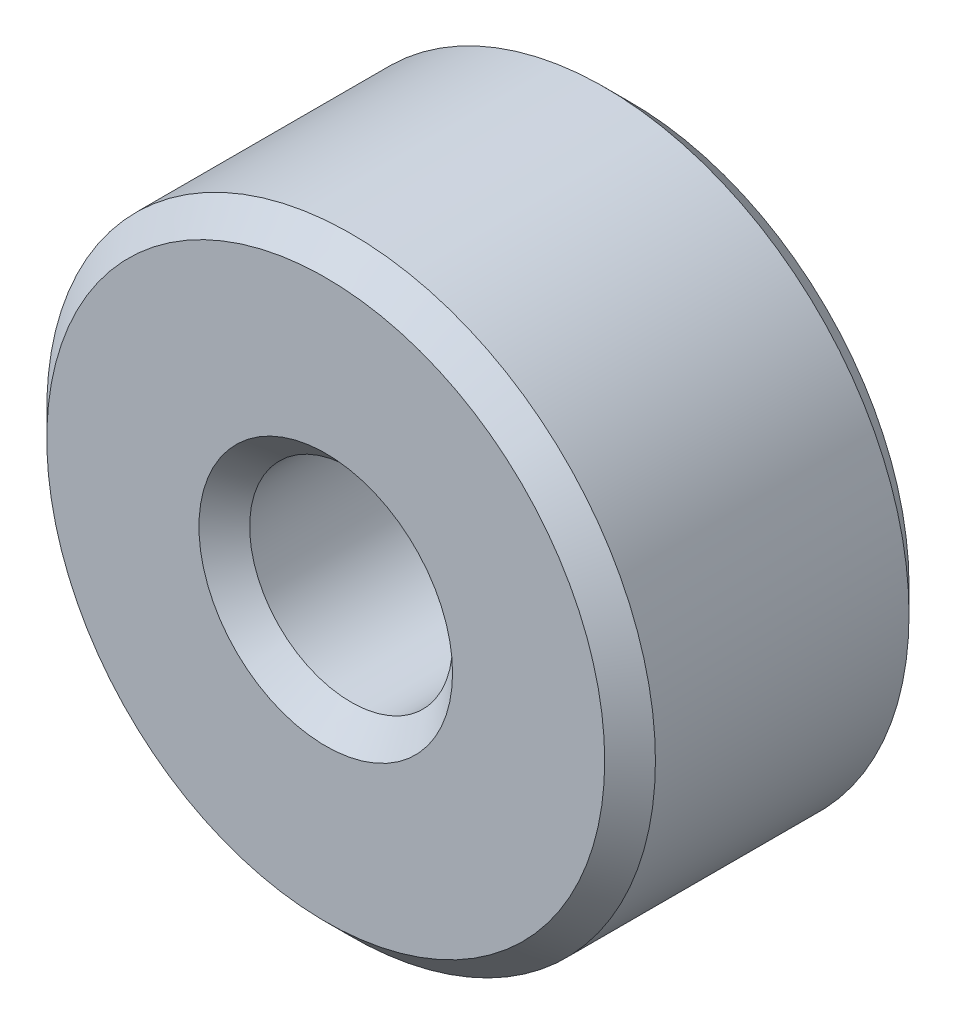
ISO-10303-21;
HEADER;
FILE_DESCRIPTION(('STEP AP214'),'2;1');
FILE_NAME('part.step','',(''),(''),'','','');
FILE_SCHEMA(('AUTOMOTIVE_DESIGN { 1 0 10303 214 1 1 1 1 }'));
ENDSEC;
DATA;
#1=APPLICATION_CONTEXT('core data for automotive mechanical design processes');
#2=APPLICATION_PROTOCOL_DEFINITION('international standard','automotive_design',2000,#1);
#3=PRODUCT_CONTEXT('',#1,'mechanical');
#4=PRODUCT('Part','Part','',(#3));
#5=PRODUCT_RELATED_PRODUCT_CATEGORY('part','',(#4));
#6=PRODUCT_DEFINITION_FORMATION('','',#4);
#7=PRODUCT_DEFINITION_CONTEXT('part definition',#1,'design');
#8=PRODUCT_DEFINITION('design','',#6,#7);
#9=PRODUCT_DEFINITION_SHAPE('','',#8);
#10=(LENGTH_UNIT() NAMED_UNIT(*) SI_UNIT(.MILLI.,.METRE.));
#11=(NAMED_UNIT(*) PLANE_ANGLE_UNIT() SI_UNIT($,.RADIAN.));
#12=(NAMED_UNIT(*) SI_UNIT($,.STERADIAN.) SOLID_ANGLE_UNIT());
#13=UNCERTAINTY_MEASURE_WITH_UNIT(LENGTH_MEASURE(1.E-05),#10,'distance_accuracy_value','');
#14=(GEOMETRIC_REPRESENTATION_CONTEXT(3) GLOBAL_UNCERTAINTY_ASSIGNED_CONTEXT((#13)) GLOBAL_UNIT_ASSIGNED_CONTEXT((#10,
#11,#12)) REPRESENTATION_CONTEXT('',''));
#15=CARTESIAN_POINT('',(0.,0.,0.));
#16=DIRECTION('',(0.,0.,1.));
#17=DIRECTION('',(1.,0.,0.));
#18=AXIS2_PLACEMENT_3D('',#15,#16,#17);
#19=CARTESIAN_POINT('',(0.,0.,1.335));
#20=DIRECTION('',(0.,0.,1.));
#21=DIRECTION('',(1.,0.,0.));
#22=AXIS2_PLACEMENT_3D('',#19,#20,#21);
#23=PLANE('',#22);
#24=CARTESIAN_POINT('',(0.,0.,1.335));
#25=DIRECTION('',(0.,0.,1.));
#26=DIRECTION('',(1.,0.,0.));
#27=AXIS2_PLACEMENT_3D('',#24,#25,#26);
#28=CIRCLE('',#27,0.55625);
#29=CARTESIAN_POINT('',(0.55625,0.,1.335));
#30=VERTEX_POINT('',#29);
#31=EDGE_CURVE('E11',#30,#30,#28,.F.);
#32=ORIENTED_EDGE('',*,*,#31,.T.);
#33=EDGE_LOOP('',(#32));
#34=FACE_BOUND('',#33,.T.);
#35=CARTESIAN_POINT('',(0.,0.,1.335));
#36=DIRECTION('',(0.,0.,1.));
#37=DIRECTION('',(1.,0.,0.));
#38=AXIS2_PLACEMENT_3D('',#35,#36,#37);
#39=CIRCLE('',#38,1.22375);
#40=CARTESIAN_POINT('',(1.22375,0.,1.335));
#41=VERTEX_POINT('',#40);
#42=EDGE_CURVE('E44',#41,#41,#39,.T.);
#43=ORIENTED_EDGE('',*,*,#42,.T.);
#44=EDGE_LOOP('',(#43));
#45=FACE_BOUND('',#44,.T.);
#46=ADVANCED_FACE('F37',(#34,#45),#23,.T.);
#47=CARTESIAN_POINT('',(0.,0.,0.));
#48=DIRECTION('',(0.,0.,1.));
#49=DIRECTION('',(1.,0.,0.));
#50=AXIS2_PLACEMENT_3D('',#47,#48,#49);
#51=PLANE('',#50);
#52=CARTESIAN_POINT('',(0.,0.,0.));
#53=DIRECTION('',(0.,0.,1.));
#54=DIRECTION('',(1.,0.,0.));
#55=AXIS2_PLACEMENT_3D('',#52,#53,#54);
#56=CIRCLE('',#55,0.55625);
#57=CARTESIAN_POINT('',(0.55625,0.,0.));
#58=VERTEX_POINT('',#57);
#59=EDGE_CURVE('E63',#58,#58,#56,.T.);
#60=ORIENTED_EDGE('',*,*,#59,.T.);
#61=EDGE_LOOP('',(#60));
#62=FACE_BOUND('',#61,.T.);
#63=CARTESIAN_POINT('',(0.,0.,0.));
#64=DIRECTION('',(0.,0.,1.));
#65=DIRECTION('',(1.,0.,0.));
#66=AXIS2_PLACEMENT_3D('',#63,#64,#65);
#67=CIRCLE('',#66,1.22375);
#68=CARTESIAN_POINT('',(1.22375,0.,0.));
#69=VERTEX_POINT('',#68);
#70=EDGE_CURVE('E66',#69,#69,#67,.F.);
#71=ORIENTED_EDGE('',*,*,#70,.T.);
#72=EDGE_LOOP('',(#71));
#73=FACE_BOUND('',#72,.T.);
#74=ADVANCED_FACE('F70',(#62,#73),#51,.F.);
#75=CARTESIAN_POINT('',(0.,0.,1.335));
#76=DIRECTION('',(0.,0.,-1.));
#77=DIRECTION('',(-1.,0.,0.));
#78=AXIS2_PLACEMENT_3D('',#75,#76,#77);
#79=CYLINDRICAL_SURFACE('',#78,1.335);
#80=CARTESIAN_POINT('',(0.,0.,0.11125));
#81=DIRECTION('',(0.,0.,1.));
#82=DIRECTION('',(1.,0.,0.));
#83=AXIS2_PLACEMENT_3D('',#80,#81,#82);
#84=CIRCLE('',#83,1.335);
#85=CARTESIAN_POINT('',(1.335,0.,0.11125));
#86=VERTEX_POINT('',#85);
#87=EDGE_CURVE('E48',#86,#86,#84,.T.);
#88=ORIENTED_EDGE('',*,*,#87,.T.);
#89=EDGE_LOOP('',(#88));
#90=FACE_BOUND('',#89,.T.);
#91=CARTESIAN_POINT('',(0.,0.,1.22375));
#92=DIRECTION('',(0.,0.,1.));
#93=DIRECTION('',(1.,0.,0.));
#94=AXIS2_PLACEMENT_3D('',#91,#92,#93);
#95=CIRCLE('',#94,1.335);
#96=CARTESIAN_POINT('',(1.335,0.,1.22375));
#97=VERTEX_POINT('',#96);
#98=EDGE_CURVE('E52',#97,#97,#95,.F.);
#99=ORIENTED_EDGE('',*,*,#98,.T.);
#100=EDGE_LOOP('',(#99));
#101=FACE_BOUND('',#100,.T.);
#102=ADVANCED_FACE('F80',(#90,#101),#79,.T.);
#103=CARTESIAN_POINT('',(0.,0.,1.335));
#104=DIRECTION('',(0.,0.,-1.));
#105=DIRECTION('',(-1.,0.,0.));
#106=AXIS2_PLACEMENT_3D('',#103,#104,#105);
#107=CYLINDRICAL_SURFACE('',#106,0.445);
#108=CARTESIAN_POINT('',(0.,0.,0.11125));
#109=DIRECTION('',(0.,0.,1.));
#110=DIRECTION('',(1.,0.,0.));
#111=AXIS2_PLACEMENT_3D('',#108,#109,#110);
#112=CIRCLE('',#111,0.445);
#113=CARTESIAN_POINT('',(0.445,0.,0.11125));
#114=VERTEX_POINT('',#113);
#115=EDGE_CURVE('E57',#114,#114,#112,.F.);
#116=ORIENTED_EDGE('',*,*,#115,.T.);
#117=EDGE_LOOP('',(#116));
#118=FACE_BOUND('',#117,.T.);
#119=CARTESIAN_POINT('',(0.,0.,1.22375));
#120=DIRECTION('',(0.,0.,1.));
#121=DIRECTION('',(1.,0.,0.));
#122=AXIS2_PLACEMENT_3D('',#119,#120,#121);
#123=CIRCLE('',#122,0.445);
#124=CARTESIAN_POINT('',(0.445,0.,1.22375));
#125=VERTEX_POINT('',#124);
#126=EDGE_CURVE('E60',#125,#125,#123,.T.);
#127=ORIENTED_EDGE('',*,*,#126,.T.);
#128=EDGE_LOOP('',(#127));
#129=FACE_BOUND('',#128,.T.);
#130=ADVANCED_FACE('F83',(#118,#129),#107,.F.);
#131=CARTESIAN_POINT('',(0.,0.,0.));
#132=DIRECTION('',(0.,0.,-1.));
#133=DIRECTION('',(-1.,0.,0.));
#134=AXIS2_PLACEMENT_3D('',#131,#132,#133);
#135=CONICAL_SURFACE('',#134,0.55625,0.785398163397447);
#136=ORIENTED_EDGE('',*,*,#115,.F.);
#137=EDGE_LOOP('',(#136));
#138=FACE_BOUND('',#137,.T.);
#139=ORIENTED_EDGE('',*,*,#59,.F.);
#140=EDGE_LOOP('',(#139));
#141=FACE_BOUND('',#140,.T.);
#142=ADVANCED_FACE('F76',(#138,#141),#135,.F.);
#143=CARTESIAN_POINT('',(0.,0.,0.11125));
#144=DIRECTION('',(0.,0.,1.));
#145=DIRECTION('',(1.,0.,0.));
#146=AXIS2_PLACEMENT_3D('',#143,#144,#145);
#147=CONICAL_SURFACE('',#146,1.335,0.78539816339745);
#148=ORIENTED_EDGE('',*,*,#70,.F.);
#149=EDGE_LOOP('',(#148));
#150=FACE_BOUND('',#149,.T.);
#151=ORIENTED_EDGE('',*,*,#87,.F.);
#152=EDGE_LOOP('',(#151));
#153=FACE_BOUND('',#152,.T.);
#154=ADVANCED_FACE('F72',(#150,#153),#147,.T.);
#155=CARTESIAN_POINT('',(0.,0.,1.22375));
#156=DIRECTION('',(0.,0.,1.));
#157=DIRECTION('',(1.,0.,0.));
#158=AXIS2_PLACEMENT_3D('',#155,#156,#157);
#159=CONICAL_SURFACE('',#158,0.445,0.78539816339745);
#160=ORIENTED_EDGE('',*,*,#31,.F.);
#161=EDGE_LOOP('',(#160));
#162=FACE_BOUND('',#161,.T.);
#163=ORIENTED_EDGE('',*,*,#126,.F.);
#164=EDGE_LOOP('',(#163));
#165=FACE_BOUND('',#164,.T.);
#166=ADVANCED_FACE('F75',(#162,#165),#159,.F.);
#167=CARTESIAN_POINT('',(0.,0.,1.335));
#168=DIRECTION('',(0.,0.,-1.));
#169=DIRECTION('',(-1.,0.,0.));
#170=AXIS2_PLACEMENT_3D('',#167,#168,#169);
#171=CONICAL_SURFACE('',#170,1.22375,0.785398163397447);
#172=ORIENTED_EDGE('',*,*,#98,.F.);
#173=EDGE_LOOP('',(#172));
#174=FACE_BOUND('',#173,.T.);
#175=ORIENTED_EDGE('',*,*,#42,.F.);
#176=EDGE_LOOP('',(#175));
#177=FACE_BOUND('',#176,.T.);
#178=ADVANCED_FACE('F39',(#174,#177),#171,.T.);
#179=CLOSED_SHELL('',(#46,#74,#102,#130,#142,#154,#166,#178));
#180=MANIFOLD_SOLID_BREP('B2',#179);
#181=ADVANCED_BREP_SHAPE_REPRESENTATION('',(#18,#180),#14);
#182=SHAPE_DEFINITION_REPRESENTATION(#9,#181);
ENDSEC;
END-ISO-10303-21;
